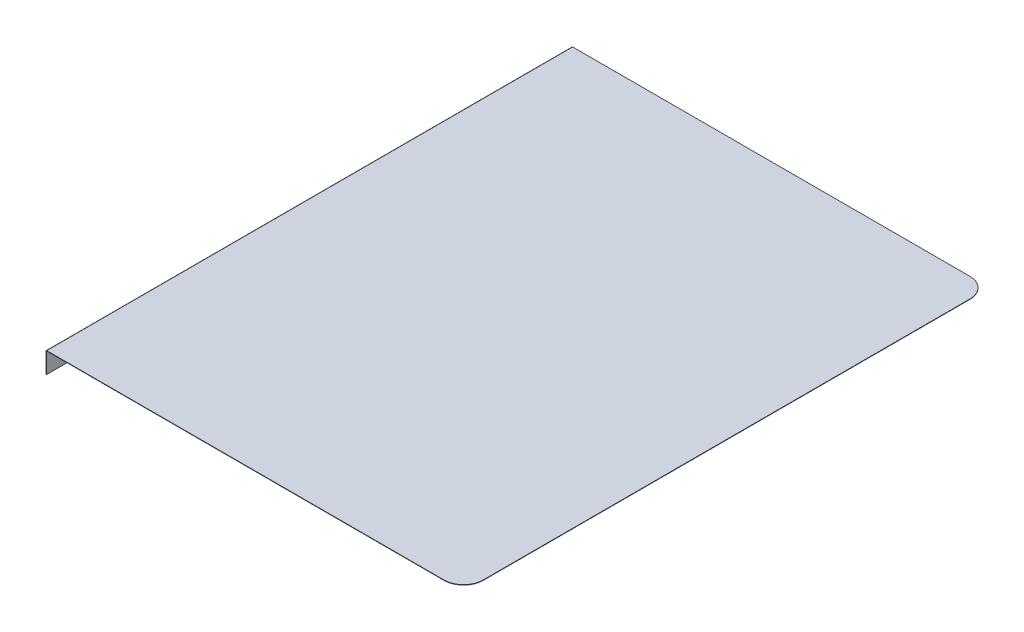
ISO-10303-21;
HEADER;
FILE_DESCRIPTION(('STEP AP214'),'2;1');
FILE_NAME('part.step','',(''),(''),'','','');
FILE_SCHEMA(('AUTOMOTIVE_DESIGN { 1 0 10303 214 1 1 1 1 }'));
ENDSEC;
DATA;
#1=APPLICATION_CONTEXT('core data for automotive mechanical design processes');
#2=APPLICATION_PROTOCOL_DEFINITION('international standard','automotive_design',2000,#1);
#3=PRODUCT_CONTEXT('',#1,'mechanical');
#4=PRODUCT('Part','Part','',(#3));
#5=PRODUCT_RELATED_PRODUCT_CATEGORY('part','',(#4));
#6=PRODUCT_DEFINITION_FORMATION('','',#4);
#7=PRODUCT_DEFINITION_CONTEXT('part definition',#1,'design');
#8=PRODUCT_DEFINITION('design','',#6,#7);
#9=PRODUCT_DEFINITION_SHAPE('','',#8);
#10=(LENGTH_UNIT() NAMED_UNIT(*) SI_UNIT(.MILLI.,.METRE.));
#11=(NAMED_UNIT(*) PLANE_ANGLE_UNIT() SI_UNIT($,.RADIAN.));
#12=(NAMED_UNIT(*) SI_UNIT($,.STERADIAN.) SOLID_ANGLE_UNIT());
#13=UNCERTAINTY_MEASURE_WITH_UNIT(LENGTH_MEASURE(1.E-05),#10,'distance_accuracy_value','');
#14=(GEOMETRIC_REPRESENTATION_CONTEXT(3) GLOBAL_UNCERTAINTY_ASSIGNED_CONTEXT((#13)) GLOBAL_UNIT_ASSIGNED_CONTEXT((#10,
#11,#12)) REPRESENTATION_CONTEXT('',''));
#15=CARTESIAN_POINT('',(0.,0.,0.));
#16=DIRECTION('',(0.,0.,1.));
#17=DIRECTION('',(1.,0.,0.));
#18=AXIS2_PLACEMENT_3D('',#15,#16,#17);
#19=CARTESIAN_POINT('',(405.,-0.8,510.));
#20=DIRECTION('',(0.,1.,0.));
#21=DIRECTION('',(0.,0.,1.));
#22=AXIS2_PLACEMENT_3D('',#19,#20,#21);
#23=PLANE('',#22);
#24=CARTESIAN_POINT('',(367.,-0.8,-472.));
#25=DIRECTION('',(0.,1.,0.));
#26=DIRECTION('',(0.,0.,1.));
#27=AXIS2_PLACEMENT_3D('',#24,#25,#26);
#28=CIRCLE('',#27,38.);
#29=CARTESIAN_POINT('',(367.,-0.8,-510.));
#30=VERTEX_POINT('',#29);
#31=CARTESIAN_POINT('',(405.,-0.8,-472.));
#32=VERTEX_POINT('',#31);
#33=EDGE_CURVE('E135',#30,#32,#28,.F.);
#34=ORIENTED_EDGE('',*,*,#33,.T.);
#35=DIRECTION('',(0.,0.,-1.));
#36=VECTOR('',#35,1.);
#37=CARTESIAN_POINT('',(405.,-0.8,-510.));
#38=LINE('',#37,#36);
#39=CARTESIAN_POINT('',(405.,-0.8,472.));
#40=VERTEX_POINT('',#39);
#41=EDGE_CURVE('E155',#40,#32,#38,.T.);
#42=ORIENTED_EDGE('',*,*,#41,.F.);
#43=CARTESIAN_POINT('',(367.,-0.8,472.));
#44=DIRECTION('',(0.,1.,0.));
#45=DIRECTION('',(0.,0.,1.));
#46=AXIS2_PLACEMENT_3D('',#43,#44,#45);
#47=CIRCLE('',#46,38.);
#48=CARTESIAN_POINT('',(367.,-0.8,510.));
#49=VERTEX_POINT('',#48);
#50=EDGE_CURVE('E217',#40,#49,#47,.F.);
#51=ORIENTED_EDGE('',*,*,#50,.T.);
#52=DIRECTION('',(1.,0.,0.));
#53=VECTOR('',#52,1.);
#54=CARTESIAN_POINT('',(-405.,-0.8,510.));
#55=LINE('',#54,#53);
#56=CARTESIAN_POINT('',(-403.4,-0.800000000000123,510.));
#57=VERTEX_POINT('',#56);
#58=EDGE_CURVE('E13',#57,#49,#55,.T.);
#59=ORIENTED_EDGE('',*,*,#58,.F.);
#60=DIRECTION('',(0.,0.,-1.));
#61=VECTOR('',#60,1.);
#62=CARTESIAN_POINT('',(-403.4,-0.799999999999985,-510.));
#63=LINE('',#62,#61);
#64=CARTESIAN_POINT('',(-403.4,-0.799999999999985,-510.));
#65=VERTEX_POINT('',#64);
#66=EDGE_CURVE('E169',#65,#57,#63,.F.);
#67=ORIENTED_EDGE('',*,*,#66,.F.);
#68=DIRECTION('',(-1.,0.,0.));
#69=VECTOR('',#68,1.);
#70=CARTESIAN_POINT('',(-405.,-0.8,-510.));
#71=LINE('',#70,#69);
#72=EDGE_CURVE('E64',#30,#65,#71,.T.);
#73=ORIENTED_EDGE('',*,*,#72,.F.);
#74=EDGE_LOOP('',(#34,#42,#51,#59,#67,#73));
#75=FACE_BOUND('',#74,.T.);
#76=ADVANCED_FACE('F55',(#75),#23,.F.);
#77=CARTESIAN_POINT('',(405.,0.,510.));
#78=DIRECTION('',(0.,1.,0.));
#79=DIRECTION('',(0.,0.,1.));
#80=AXIS2_PLACEMENT_3D('',#77,#78,#79);
#81=PLANE('',#80);
#82=DIRECTION('',(0.,0.,-1.));
#83=VECTOR('',#82,1.);
#84=CARTESIAN_POINT('',(405.,0.,-510.));
#85=LINE('',#84,#83);
#86=CARTESIAN_POINT('',(405.,0.,472.));
#87=VERTEX_POINT('',#86);
#88=CARTESIAN_POINT('',(405.,0.,-472.));
#89=VERTEX_POINT('',#88);
#90=EDGE_CURVE('E148',#87,#89,#85,.T.);
#91=ORIENTED_EDGE('',*,*,#90,.T.);
#92=CARTESIAN_POINT('',(367.,0.,-472.));
#93=DIRECTION('',(0.,1.,0.));
#94=DIRECTION('',(0.,0.,1.));
#95=AXIS2_PLACEMENT_3D('',#92,#93,#94);
#96=CIRCLE('',#95,38.);
#97=CARTESIAN_POINT('',(367.,0.,-510.));
#98=VERTEX_POINT('',#97);
#99=EDGE_CURVE('E72',#98,#89,#96,.F.);
#100=ORIENTED_EDGE('',*,*,#99,.F.);
#101=DIRECTION('',(-1.,0.,0.));
#102=VECTOR('',#101,1.);
#103=CARTESIAN_POINT('',(-405.,0.,-510.));
#104=LINE('',#103,#102);
#105=CARTESIAN_POINT('',(-403.4,0.,-510.));
#106=VERTEX_POINT('',#105);
#107=EDGE_CURVE('E145',#98,#106,#104,.T.);
#108=ORIENTED_EDGE('',*,*,#107,.T.);
#109=DIRECTION('',(0.,0.,-1.));
#110=VECTOR('',#109,1.);
#111=CARTESIAN_POINT('',(-403.4,0.,-510.));
#112=LINE('',#111,#110);
#113=CARTESIAN_POINT('',(-403.4,0.,510.));
#114=VERTEX_POINT('',#113);
#115=EDGE_CURVE('E178',#106,#114,#112,.F.);
#116=ORIENTED_EDGE('',*,*,#115,.T.);
#117=DIRECTION('',(1.,0.,0.));
#118=VECTOR('',#117,1.);
#119=CARTESIAN_POINT('',(-405.,0.,510.));
#120=LINE('',#119,#118);
#121=CARTESIAN_POINT('',(367.,0.,510.));
#122=VERTEX_POINT('',#121);
#123=EDGE_CURVE('E59',#114,#122,#120,.T.);
#124=ORIENTED_EDGE('',*,*,#123,.T.);
#125=CARTESIAN_POINT('',(367.,0.,472.));
#126=DIRECTION('',(0.,1.,0.));
#127=DIRECTION('',(0.,0.,1.));
#128=AXIS2_PLACEMENT_3D('',#125,#126,#127);
#129=CIRCLE('',#128,38.);
#130=EDGE_CURVE('E80',#87,#122,#129,.F.);
#131=ORIENTED_EDGE('',*,*,#130,.F.);
#132=EDGE_LOOP('',(#91,#100,#108,#116,#124,#131));
#133=FACE_BOUND('',#132,.T.);
#134=ADVANCED_FACE('F143',(#133),#81,.T.);
#135=CARTESIAN_POINT('',(405.,-0.8,-510.));
#136=DIRECTION('',(1.,0.,0.));
#137=DIRECTION('',(0.,0.,-1.));
#138=AXIS2_PLACEMENT_3D('',#135,#136,#137);
#139=PLANE('',#138);
#140=ORIENTED_EDGE('',*,*,#41,.T.);
#141=DIRECTION('',(0.,-1.,0.));
#142=VECTOR('',#141,1.);
#143=CARTESIAN_POINT('',(405.,-0.8,-472.));
#144=LINE('',#143,#142);
#145=EDGE_CURVE('E139',#32,#89,#144,.F.);
#146=ORIENTED_EDGE('',*,*,#145,.T.);
#147=ORIENTED_EDGE('',*,*,#90,.F.);
#148=DIRECTION('',(0.,-1.,0.));
#149=VECTOR('',#148,1.);
#150=CARTESIAN_POINT('',(405.,-0.8,472.));
#151=LINE('',#150,#149);
#152=EDGE_CURVE('E214',#40,#87,#151,.F.);
#153=ORIENTED_EDGE('',*,*,#152,.F.);
#154=EDGE_LOOP('',(#140,#146,#147,#153));
#155=FACE_BOUND('',#154,.T.);
#156=ADVANCED_FACE('F57',(#155),#139,.T.);
#157=CARTESIAN_POINT('',(-405.,-0.8,510.));
#158=DIRECTION('',(0.,0.,1.));
#159=DIRECTION('',(1.,0.,0.));
#160=AXIS2_PLACEMENT_3D('',#157,#158,#159);
#161=PLANE('',#160);
#162=ORIENTED_EDGE('',*,*,#58,.T.);
#163=DIRECTION('',(0.,-1.,0.));
#164=VECTOR('',#163,1.);
#165=CARTESIAN_POINT('',(367.,-0.8,510.));
#166=LINE('',#165,#164);
#167=EDGE_CURVE('E186',#49,#122,#166,.F.);
#168=ORIENTED_EDGE('',*,*,#167,.T.);
#169=ORIENTED_EDGE('',*,*,#123,.F.);
#170=DIRECTION('',(0.,1.,0.));
#171=VECTOR('',#170,1.);
#172=CARTESIAN_POINT('',(-403.4,-0.800000000000123,510.));
#173=LINE('',#172,#171);
#174=EDGE_CURVE('E156',#57,#114,#173,.T.);
#175=ORIENTED_EDGE('',*,*,#174,.F.);
#176=EDGE_LOOP('',(#162,#168,#169,#175));
#177=FACE_BOUND('',#176,.T.);
#178=ADVANCED_FACE('F231',(#177),#161,.T.);
#179=CARTESIAN_POINT('',(-405.,-0.8,-510.));
#180=DIRECTION('',(0.,0.,-1.));
#181=DIRECTION('',(-1.,0.,0.));
#182=AXIS2_PLACEMENT_3D('',#179,#180,#181);
#183=PLANE('',#182);
#184=DIRECTION('',(0.,-1.,0.));
#185=VECTOR('',#184,1.);
#186=CARTESIAN_POINT('',(367.,-0.8,-510.));
#187=LINE('',#186,#185);
#188=EDGE_CURVE('E132',#30,#98,#187,.F.);
#189=ORIENTED_EDGE('',*,*,#188,.F.);
#190=ORIENTED_EDGE('',*,*,#72,.T.);
#191=DIRECTION('',(0.,1.,0.));
#192=VECTOR('',#191,1.);
#193=CARTESIAN_POINT('',(-403.4,-0.799999999999985,-510.));
#194=LINE('',#193,#192);
#195=EDGE_CURVE('E153',#65,#106,#194,.T.);
#196=ORIENTED_EDGE('',*,*,#195,.T.);
#197=ORIENTED_EDGE('',*,*,#107,.F.);
#198=EDGE_LOOP('',(#189,#190,#196,#197));
#199=FACE_BOUND('',#198,.T.);
#200=ADVANCED_FACE('F151',(#199),#183,.T.);
#201=CARTESIAN_POINT('',(-403.4,-1.60000000000009,510.));
#202=DIRECTION('',(0.,0.,1.));
#203=DIRECTION('',(0.,-1.,0.));
#204=AXIS2_PLACEMENT_3D('',#201,#202,#203);
#205=PLANE('',#204);
#206=DIRECTION('',(-1.,0.,0.));
#207=VECTOR('',#206,1.);
#208=CARTESIAN_POINT('',(-405.,-1.60000000000005,510.));
#209=LINE('',#208,#207);
#210=CARTESIAN_POINT('',(-404.2,-1.60000000000009,510.));
#211=VERTEX_POINT('',#210);
#212=CARTESIAN_POINT('',(-405.,-1.60000000000008,510.));
#213=VERTEX_POINT('',#212);
#214=EDGE_CURVE('E182',#211,#213,#209,.T.);
#215=ORIENTED_EDGE('',*,*,#214,.F.);
#216=CARTESIAN_POINT('',(-403.4,-1.60000000000009,510.));
#217=DIRECTION('',(0.,0.,-1.));
#218=DIRECTION('',(0.,1.,0.));
#219=AXIS2_PLACEMENT_3D('',#216,#217,#218);
#220=CIRCLE('',#219,0.799999999999967);
#221=EDGE_CURVE('E172',#57,#211,#220,.F.);
#222=ORIENTED_EDGE('',*,*,#221,.F.);
#223=ORIENTED_EDGE('',*,*,#174,.T.);
#224=CARTESIAN_POINT('',(-403.4,-1.60000000000009,510.));
#225=DIRECTION('',(0.,0.,-1.));
#226=DIRECTION('',(0.,1.,0.));
#227=AXIS2_PLACEMENT_3D('',#224,#225,#226);
#228=CIRCLE('',#227,1.59999999999997);
#229=EDGE_CURVE('E163',#114,#213,#228,.F.);
#230=ORIENTED_EDGE('',*,*,#229,.T.);
#231=EDGE_LOOP('',(#215,#222,#223,#230));
#232=FACE_BOUND('',#231,.T.);
#233=ADVANCED_FACE('F239',(#232),#205,.T.);
#234=CARTESIAN_POINT('',(-403.4,-1.59999999999995,-510.));
#235=DIRECTION('',(0.,0.,1.));
#236=DIRECTION('',(0.,-1.,0.));
#237=AXIS2_PLACEMENT_3D('',#234,#235,#236);
#238=PLANE('',#237);
#239=CARTESIAN_POINT('',(-403.4,-1.59999999999995,-510.));
#240=DIRECTION('',(0.,0.,-1.));
#241=DIRECTION('',(0.,1.,0.));
#242=AXIS2_PLACEMENT_3D('',#239,#240,#241);
#243=CIRCLE('',#242,0.799999999999967);
#244=CARTESIAN_POINT('',(-404.2,-1.59999999999995,-510.));
#245=VERTEX_POINT('',#244);
#246=EDGE_CURVE('E166',#245,#65,#243,.T.);
#247=ORIENTED_EDGE('',*,*,#246,.F.);
#248=DIRECTION('',(-1.,0.,0.));
#249=VECTOR('',#248,1.);
#250=CARTESIAN_POINT('',(-404.2,-1.59999999999999,-510.));
#251=LINE('',#250,#249);
#252=CARTESIAN_POINT('',(-405.,-1.59999999999999,-510.));
#253=VERTEX_POINT('',#252);
#254=EDGE_CURVE('E188',#245,#253,#251,.T.);
#255=ORIENTED_EDGE('',*,*,#254,.T.);
#256=CARTESIAN_POINT('',(-403.4,-1.59999999999995,-510.));
#257=DIRECTION('',(0.,0.,-1.));
#258=DIRECTION('',(0.,1.,0.));
#259=AXIS2_PLACEMENT_3D('',#256,#257,#258);
#260=CIRCLE('',#259,1.59999999999997);
#261=EDGE_CURVE('E175',#253,#106,#260,.T.);
#262=ORIENTED_EDGE('',*,*,#261,.T.);
#263=ORIENTED_EDGE('',*,*,#195,.F.);
#264=EDGE_LOOP('',(#247,#255,#262,#263));
#265=FACE_BOUND('',#264,.T.);
#266=ADVANCED_FACE('F259',(#265),#238,.F.);
#267=CARTESIAN_POINT('',(-403.4,-1.59999999999995,-510.));
#268=DIRECTION('',(0.,0.,-1.));
#269=DIRECTION('',(-1.,0.,0.));
#270=AXIS2_PLACEMENT_3D('',#267,#268,#269);
#271=CYLINDRICAL_SURFACE('',#270,1.59999999999997);
#272=ORIENTED_EDGE('',*,*,#115,.F.);
#273=ORIENTED_EDGE('',*,*,#261,.F.);
#274=DIRECTION('',(0.,0.,-1.));
#275=VECTOR('',#274,1.);
#276=CARTESIAN_POINT('',(-405.,-1.59999999999999,-510.));
#277=LINE('',#276,#275);
#278=EDGE_CURVE('E191',#213,#253,#277,.T.);
#279=ORIENTED_EDGE('',*,*,#278,.F.);
#280=ORIENTED_EDGE('',*,*,#229,.F.);
#281=EDGE_LOOP('',(#272,#273,#279,#280));
#282=FACE_BOUND('',#281,.T.);
#283=ADVANCED_FACE('F261',(#282),#271,.T.);
#284=CARTESIAN_POINT('',(-403.4,-1.59999999999995,-510.));
#285=DIRECTION('',(0.,0.,-1.));
#286=DIRECTION('',(-1.,0.,0.));
#287=AXIS2_PLACEMENT_3D('',#284,#285,#286);
#288=CYLINDRICAL_SURFACE('',#287,0.799999999999967);
#289=ORIENTED_EDGE('',*,*,#66,.T.);
#290=ORIENTED_EDGE('',*,*,#221,.T.);
#291=DIRECTION('',(0.,0.,1.));
#292=VECTOR('',#291,1.);
#293=CARTESIAN_POINT('',(-404.2,-1.60000000000005,510.));
#294=LINE('',#293,#292);
#295=EDGE_CURVE('E185',#211,#245,#294,.F.);
#296=ORIENTED_EDGE('',*,*,#295,.T.);
#297=ORIENTED_EDGE('',*,*,#246,.T.);
#298=EDGE_LOOP('',(#289,#290,#296,#297));
#299=FACE_BOUND('',#298,.T.);
#300=ADVANCED_FACE('F235',(#299),#288,.F.);
#301=CARTESIAN_POINT('',(-405.,-0.799999999999997,-510.));
#302=DIRECTION('',(0.,0.,-1.));
#303=DIRECTION('',(-1.,0.,0.));
#304=AXIS2_PLACEMENT_3D('',#301,#302,#303);
#305=PLANE('',#304);
#306=DIRECTION('',(0.,1.,0.));
#307=VECTOR('',#306,1.);
#308=CARTESIAN_POINT('',(-405.,-0.799999999999997,-510.));
#309=LINE('',#308,#307);
#310=CARTESIAN_POINT('',(-405.,-40.8,-510.));
#311=VERTEX_POINT('',#310);
#312=EDGE_CURVE('E207',#311,#253,#309,.T.);
#313=ORIENTED_EDGE('',*,*,#312,.T.);
#314=ORIENTED_EDGE('',*,*,#254,.F.);
#315=DIRECTION('',(0.,-1.,0.));
#316=VECTOR('',#315,1.);
#317=CARTESIAN_POINT('',(-404.2,-0.8,-510.));
#318=LINE('',#317,#316);
#319=CARTESIAN_POINT('',(-404.2,-40.8,-510.));
#320=VERTEX_POINT('',#319);
#321=EDGE_CURVE('E199',#320,#245,#318,.F.);
#322=ORIENTED_EDGE('',*,*,#321,.F.);
#323=DIRECTION('',(1.,0.,0.));
#324=VECTOR('',#323,1.);
#325=CARTESIAN_POINT('',(-405.,-40.8,-510.));
#326=LINE('',#325,#324);
#327=EDGE_CURVE('E170',#311,#320,#326,.T.);
#328=ORIENTED_EDGE('',*,*,#327,.F.);
#329=EDGE_LOOP('',(#313,#314,#322,#328));
#330=FACE_BOUND('',#329,.T.);
#331=ADVANCED_FACE('F257',(#330),#305,.T.);
#332=CARTESIAN_POINT('',(-405.,-40.8,510.));
#333=DIRECTION('',(0.,0.,1.));
#334=DIRECTION('',(1.,0.,0.));
#335=AXIS2_PLACEMENT_3D('',#332,#333,#334);
#336=PLANE('',#335);
#337=DIRECTION('',(0.,1.,0.));
#338=VECTOR('',#337,1.);
#339=CARTESIAN_POINT('',(-404.2,-0.8,510.));
#340=LINE('',#339,#338);
#341=CARTESIAN_POINT('',(-404.2,-40.8,510.));
#342=VERTEX_POINT('',#341);
#343=EDGE_CURVE('E194',#211,#342,#340,.F.);
#344=ORIENTED_EDGE('',*,*,#343,.F.);
#345=ORIENTED_EDGE('',*,*,#214,.T.);
#346=DIRECTION('',(0.,-1.,0.));
#347=VECTOR('',#346,1.);
#348=CARTESIAN_POINT('',(-405.,-40.8,510.));
#349=LINE('',#348,#347);
#350=CARTESIAN_POINT('',(-405.,-40.8,510.));
#351=VERTEX_POINT('',#350);
#352=EDGE_CURVE('E202',#213,#351,#349,.T.);
#353=ORIENTED_EDGE('',*,*,#352,.T.);
#354=DIRECTION('',(1.,0.,0.));
#355=VECTOR('',#354,1.);
#356=CARTESIAN_POINT('',(-405.,-40.8,510.));
#357=LINE('',#356,#355);
#358=EDGE_CURVE('E210',#351,#342,#357,.T.);
#359=ORIENTED_EDGE('',*,*,#358,.T.);
#360=EDGE_LOOP('',(#344,#345,#353,#359));
#361=FACE_BOUND('',#360,.T.);
#362=ADVANCED_FACE('F243',(#361),#336,.T.);
#363=CARTESIAN_POINT('',(-405.,-0.799999999999997,-510.));
#364=DIRECTION('',(-1.,0.,0.));
#365=DIRECTION('',(0.,-1.,0.));
#366=AXIS2_PLACEMENT_3D('',#363,#364,#365);
#367=PLANE('',#366);
#368=ORIENTED_EDGE('',*,*,#352,.F.);
#369=ORIENTED_EDGE('',*,*,#278,.T.);
#370=ORIENTED_EDGE('',*,*,#312,.F.);
#371=DIRECTION('',(0.,0.,-1.));
#372=VECTOR('',#371,1.);
#373=CARTESIAN_POINT('',(-405.,-40.8,-510.));
#374=LINE('',#373,#372);
#375=EDGE_CURVE('E204',#351,#311,#374,.T.);
#376=ORIENTED_EDGE('',*,*,#375,.F.);
#377=EDGE_LOOP('',(#368,#369,#370,#376));
#378=FACE_BOUND('',#377,.T.);
#379=ADVANCED_FACE('F247',(#378),#367,.T.);
#380=CARTESIAN_POINT('',(-404.2,-0.8,-510.));
#381=DIRECTION('',(-1.,0.,0.));
#382=DIRECTION('',(0.,-1.,0.));
#383=AXIS2_PLACEMENT_3D('',#380,#381,#382);
#384=PLANE('',#383);
#385=ORIENTED_EDGE('',*,*,#295,.F.);
#386=ORIENTED_EDGE('',*,*,#343,.T.);
#387=DIRECTION('',(0.,0.,1.));
#388=VECTOR('',#387,1.);
#389=CARTESIAN_POINT('',(-404.2,-40.8,-510.));
#390=LINE('',#389,#388);
#391=EDGE_CURVE('E196',#342,#320,#390,.F.);
#392=ORIENTED_EDGE('',*,*,#391,.T.);
#393=ORIENTED_EDGE('',*,*,#321,.T.);
#394=EDGE_LOOP('',(#385,#386,#392,#393));
#395=FACE_BOUND('',#394,.T.);
#396=ADVANCED_FACE('F254',(#395),#384,.F.);
#397=CARTESIAN_POINT('',(-405.,-40.8,-510.));
#398=DIRECTION('',(0.,-1.,0.));
#399=DIRECTION('',(1.,0.,0.));
#400=AXIS2_PLACEMENT_3D('',#397,#398,#399);
#401=PLANE('',#400);
#402=ORIENTED_EDGE('',*,*,#391,.F.);
#403=ORIENTED_EDGE('',*,*,#358,.F.);
#404=ORIENTED_EDGE('',*,*,#375,.T.);
#405=ORIENTED_EDGE('',*,*,#327,.T.);
#406=EDGE_LOOP('',(#402,#403,#404,#405));
#407=FACE_BOUND('',#406,.T.);
#408=ADVANCED_FACE('F251',(#407),#401,.T.);
#409=CARTESIAN_POINT('',(367.,-0.8,472.));
#410=DIRECTION('',(0.,1.,0.));
#411=DIRECTION('',(0.,0.,1.));
#412=AXIS2_PLACEMENT_3D('',#409,#410,#411);
#413=CYLINDRICAL_SURFACE('',#412,38.);
#414=ORIENTED_EDGE('',*,*,#167,.F.);
#415=ORIENTED_EDGE('',*,*,#50,.F.);
#416=ORIENTED_EDGE('',*,*,#152,.T.);
#417=ORIENTED_EDGE('',*,*,#130,.T.);
#418=EDGE_LOOP('',(#414,#415,#416,#417));
#419=FACE_BOUND('',#418,.T.);
#420=ADVANCED_FACE('F227',(#419),#413,.T.);
#421=CARTESIAN_POINT('',(367.,-0.8,-472.));
#422=DIRECTION('',(0.,1.,0.));
#423=DIRECTION('',(0.,0.,1.));
#424=AXIS2_PLACEMENT_3D('',#421,#422,#423);
#425=CYLINDRICAL_SURFACE('',#424,38.);
#426=ORIENTED_EDGE('',*,*,#145,.F.);
#427=ORIENTED_EDGE('',*,*,#33,.F.);
#428=ORIENTED_EDGE('',*,*,#188,.T.);
#429=ORIENTED_EDGE('',*,*,#99,.T.);
#430=EDGE_LOOP('',(#426,#427,#428,#429));
#431=FACE_BOUND('',#430,.T.);
#432=ADVANCED_FACE('F133',(#431),#425,.T.);
#433=CLOSED_SHELL('',(#76,#134,#156,#178,#200,#233,#266,#283,#300,#331,#362,#379,#396,#408,#420,#432));
#434=MANIFOLD_SOLID_BREP('B2',#433);
#435=ADVANCED_BREP_SHAPE_REPRESENTATION('',(#18,#434),#14);
#436=SHAPE_DEFINITION_REPRESENTATION(#9,#435);
ENDSEC;
END-ISO-10303-21;
